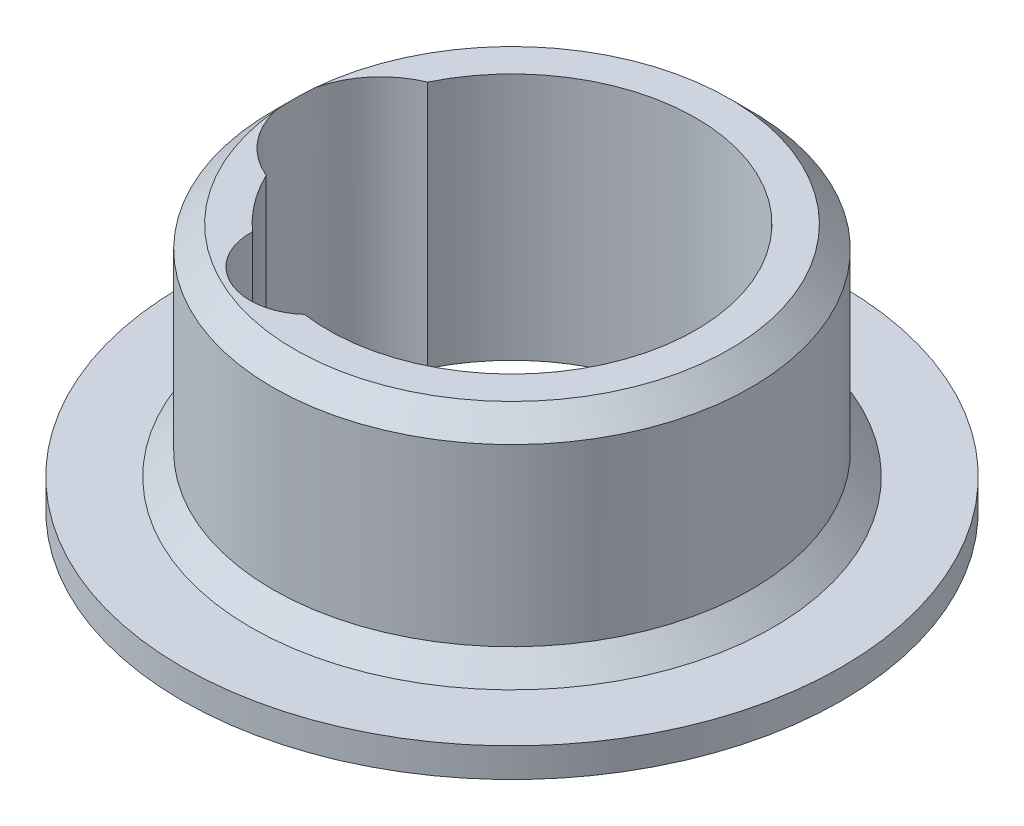
ISO-10303-21;
HEADER;
FILE_DESCRIPTION(('STEP AP214'),'2;1');
FILE_NAME('part.step','',(''),(''),'','','');
FILE_SCHEMA(('AUTOMOTIVE_DESIGN { 1 0 10303 214 1 1 1 1 }'));
ENDSEC;
DATA;
#1=APPLICATION_CONTEXT('core data for automotive mechanical design processes');
#2=APPLICATION_PROTOCOL_DEFINITION('international standard','automotive_design',2000,#1);
#3=PRODUCT_CONTEXT('',#1,'mechanical');
#4=PRODUCT('Part','Part','',(#3));
#5=PRODUCT_RELATED_PRODUCT_CATEGORY('part','',(#4));
#6=PRODUCT_DEFINITION_FORMATION('','',#4);
#7=PRODUCT_DEFINITION_CONTEXT('part definition',#1,'design');
#8=PRODUCT_DEFINITION('design','',#6,#7);
#9=PRODUCT_DEFINITION_SHAPE('','',#8);
#10=(LENGTH_UNIT() NAMED_UNIT(*) SI_UNIT(.MILLI.,.METRE.));
#11=(NAMED_UNIT(*) PLANE_ANGLE_UNIT() SI_UNIT($,.RADIAN.));
#12=(NAMED_UNIT(*) SI_UNIT($,.STERADIAN.) SOLID_ANGLE_UNIT());
#13=UNCERTAINTY_MEASURE_WITH_UNIT(LENGTH_MEASURE(1.E-05),#10,'distance_accuracy_value','');
#14=(GEOMETRIC_REPRESENTATION_CONTEXT(3) GLOBAL_UNCERTAINTY_ASSIGNED_CONTEXT((#13)) GLOBAL_UNIT_ASSIGNED_CONTEXT((#10,
#11,#12)) REPRESENTATION_CONTEXT('',''));
#15=CARTESIAN_POINT('',(0.,0.,0.));
#16=DIRECTION('',(0.,0.,1.));
#17=DIRECTION('',(1.,0.,0.));
#18=AXIS2_PLACEMENT_3D('',#15,#16,#17);
#19=CARTESIAN_POINT('',(0.,2.,0.));
#20=DIRECTION('',(0.,-1.,0.));
#21=DIRECTION('',(0.,0.,-1.));
#22=AXIS2_PLACEMENT_3D('',#19,#20,#21);
#23=CYLINDRICAL_SURFACE('',#22,12.6);
#24=CARTESIAN_POINT('',(0.,17.,0.));
#25=DIRECTION('',(0.,1.,0.));
#26=DIRECTION('',(0.,0.,1.));
#27=AXIS2_PLACEMENT_3D('',#24,#25,#26);
#28=CIRCLE('',#27,12.6);
#29=CARTESIAN_POINT('',(-11.32,17.,5.53331726905299));
#30=VERTEX_POINT('',#29);
#31=CARTESIAN_POINT('',(-8.43446094107925,17.,9.36054852203697));
#32=VERTEX_POINT('',#31);
#33=EDGE_CURVE('E102',#30,#32,#28,.T.);
#34=ORIENTED_EDGE('',*,*,#33,.T.);
#35=DIRECTION('',(0.,-1.,0.));
#36=VECTOR('',#35,1.);
#37=CARTESIAN_POINT('',(-8.43446094107925,8.5,9.36054852203697));
#38=LINE('',#37,#36);
#39=CARTESIAN_POINT('',(-8.43446094107925,0.,9.36054852203697));
#40=VERTEX_POINT('',#39);
#41=EDGE_CURVE('E50',#32,#40,#38,.T.);
#42=ORIENTED_EDGE('',*,*,#41,.T.);
#43=CARTESIAN_POINT('',(0.,0.,0.));
#44=DIRECTION('',(0.,1.,0.));
#45=DIRECTION('',(0.,0.,1.));
#46=AXIS2_PLACEMENT_3D('',#43,#44,#45);
#47=CIRCLE('',#46,12.6);
#48=CARTESIAN_POINT('',(-11.32,0.,5.53331726905299));
#49=VERTEX_POINT('',#48);
#50=EDGE_CURVE('E110',#49,#40,#47,.T.);
#51=ORIENTED_EDGE('',*,*,#50,.F.);
#52=DIRECTION('',(0.,-1.,0.));
#53=VECTOR('',#52,1.);
#54=CARTESIAN_POINT('',(-11.32,8.5,5.53331726905299));
#55=LINE('',#54,#53);
#56=EDGE_CURVE('E88',#49,#30,#55,.F.);
#57=ORIENTED_EDGE('',*,*,#56,.T.);
#58=EDGE_LOOP('',(#34,#42,#51,#57));
#59=FACE_BOUND('',#58,.T.);
#60=ADVANCED_FACE('F35',(#59),#23,.F.);
#61=CARTESIAN_POINT('',(-1.7490291925411,0.,12.4780165444528));
#62=VERTEX_POINT('',#61);
#63=CARTESIAN_POINT('',(-11.32,0.,-5.53331726905299));
#64=VERTEX_POINT('',#63);
#65=EDGE_CURVE('E105',#62,#64,#47,.T.);
#66=ORIENTED_EDGE('',*,*,#65,.F.);
#67=DIRECTION('',(0.,-1.,0.));
#68=VECTOR('',#67,1.);
#69=CARTESIAN_POINT('',(-1.7490291925411,8.5,12.4780165444528));
#70=LINE('',#69,#68);
#71=CARTESIAN_POINT('',(-1.74902919254111,17.,12.4780165444528));
#72=VERTEX_POINT('',#71);
#73=EDGE_CURVE('E87',#62,#72,#70,.F.);
#74=ORIENTED_EDGE('',*,*,#73,.T.);
#75=CARTESIAN_POINT('',(-11.32,17.,-5.53331726905299));
#76=VERTEX_POINT('',#75);
#77=EDGE_CURVE('E94',#72,#76,#28,.T.);
#78=ORIENTED_EDGE('',*,*,#77,.T.);
#79=DIRECTION('',(0.,-1.,0.));
#80=VECTOR('',#79,1.);
#81=CARTESIAN_POINT('',(-11.32,8.5,-5.53331726905299));
#82=LINE('',#81,#80);
#83=EDGE_CURVE('E79',#76,#64,#82,.T.);
#84=ORIENTED_EDGE('',*,*,#83,.T.);
#85=EDGE_LOOP('',(#66,#74,#78,#84));
#86=FACE_BOUND('',#85,.T.);
#87=ADVANCED_FACE('F101',(#86),#23,.F.);
#88=CARTESIAN_POINT('',(0.,17.,0.));
#89=DIRECTION('',(0.,-1.,0.));
#90=DIRECTION('',(0.,0.,-1.));
#91=AXIS2_PLACEMENT_3D('',#88,#89,#90);
#92=CONICAL_SURFACE('',#91,14.9,0.785398163397447);
#93=CARTESIAN_POINT('',(0.,15.5,0.));
#94=DIRECTION('',(0.,1.,0.));
#95=DIRECTION('',(0.,0.,1.));
#96=AXIS2_PLACEMENT_3D('',#93,#94,#95);
#97=CIRCLE('',#96,16.4);
#98=CARTESIAN_POINT('',(0.,15.5,16.4));
#99=VERTEX_POINT('',#98);
#100=EDGE_CURVE('E121',#99,#99,#97,.F.);
#101=ORIENTED_EDGE('',*,*,#100,.F.);
#102=EDGE_LOOP('',(#101));
#103=FACE_BOUND('',#102,.T.);
#104=CARTESIAN_POINT('',(0.,17.,0.));
#105=DIRECTION('',(0.,1.,0.));
#106=DIRECTION('',(0.,0.,1.));
#107=AXIS2_PLACEMENT_3D('',#104,#105,#106);
#108=CIRCLE('',#107,14.9);
#109=CARTESIAN_POINT('',(-14.8338888888889,17.,1.40204865539641));
#110=VERTEX_POINT('',#109);
#111=CARTESIAN_POINT('',(-14.8338888888889,17.,-1.40204865539641));
#112=VERTEX_POINT('',#111);
#113=EDGE_CURVE('E97',#110,#112,#108,.T.);
#114=ORIENTED_EDGE('',*,*,#113,.F.);
#115=CARTESIAN_POINT('',(-13.1740823327844,18.0387777598756,4.3101086621032));
#116=CARTESIAN_POINT('',(-13.2812787352416,17.9691750214918,4.20631419640567));
#117=CARTESIAN_POINT('',(-13.3854469041669,17.9020645110911,4.09766550659816));
#118=CARTESIAN_POINT('',(-13.5868019883373,17.7731961994844,3.87094477164192));
#119=CARTESIAN_POINT('',(-13.6839833188587,17.7114426722567,3.75286534399564));
#120=CARTESIAN_POINT('',(-13.8703563481507,17.5937116882185,3.50761628938948));
#121=CARTESIAN_POINT('',(-13.9595403153277,17.53773981315,3.38043807503303));
#122=CARTESIAN_POINT('',(-14.1287475318279,17.4320960788176,3.11775000347546));
#123=CARTESIAN_POINT('',(-14.2087743764662,17.3824217461486,2.98224344853279));
#124=CARTESIAN_POINT('',(-14.4036987746067,17.2619644825541,2.61993000763345));
#125=CARTESIAN_POINT('',(-14.510756852405,17.1963690856103,2.38706962222009));
#126=CARTESIAN_POINT('',(-14.6951492671273,17.0839320634582,1.90567637117447));
#127=CARTESIAN_POINT('',(-14.772505344858,17.0370767201474,1.65715512444694));
#128=CARTESIAN_POINT('',(-14.8673558061589,16.9797854113059,1.26296355457812));
#129=CARTESIAN_POINT('',(-14.8961573846878,16.9624288918613,1.12090531717421));
#130=CARTESIAN_POINT('',(-14.9434568649052,16.9339573970457,0.834480690181248));
#131=CARTESIAN_POINT('',(-14.9619578298858,16.9228405660502,0.690114999956206));
#132=CARTESIAN_POINT('',(-14.9884141481795,16.9069510395924,0.400118729801096));
#133=CARTESIAN_POINT('',(-14.9963725398987,16.9021765162541,0.254488526492392));
#134=CARTESIAN_POINT('',(-15.0016561797809,16.8990062752455,-0.0369871678342193));
#135=CARTESIAN_POINT('',(-14.99898431379,16.9006088263609,-0.182832589679684));
#136=CARTESIAN_POINT('',(-14.9810503743423,16.9113726883445,-0.510046099215776));
#137=CARTESIAN_POINT('',(-14.9628145371252,16.922319448847,-0.69120204406204));
#138=CARTESIAN_POINT('',(-14.9101541055416,16.9539964341598,-1.05023862662286));
#139=CARTESIAN_POINT('',(-14.8757314889123,16.9747254637515,-1.22811966171488));
#140=CARTESIAN_POINT('',(-14.7963886046394,17.0226516062133,-1.55792904163438));
#141=CARTESIAN_POINT('',(-14.7531987545188,17.0487892931889,-1.71043225531484));
#142=CARTESIAN_POINT('',(-14.6553815150557,17.108186405903,-2.01036016490023));
#143=CARTESIAN_POINT('',(-14.600749805371,17.1414485218691,-2.15778291791271));
#144=CARTESIAN_POINT('',(-14.4807395966339,17.2148149884928,-2.44662721553154));
#145=CARTESIAN_POINT('',(-14.4153482324007,17.2549275323226,-2.58804131783802));
#146=CARTESIAN_POINT('',(-14.2746838824578,17.341628216465,-2.86385866184187));
#147=CARTESIAN_POINT('',(-14.1994068676149,17.3882189975959,-2.99825901353714));
#148=CARTESIAN_POINT('',(-14.0403518848477,17.4872012270934,-3.2585246180598));
#149=CARTESIAN_POINT('',(-13.956624304906,17.5395584451353,-3.38443376970832));
#150=CARTESIAN_POINT('',(-13.7812056774405,17.649921123316,-3.6280313632243));
#151=CARTESIAN_POINT('',(-13.6895113090699,17.7079289400621,-3.74571633971941));
#152=CARTESIAN_POINT('',(-13.4991546055221,17.8291629838064,-3.97234162311977));
#153=CARTESIAN_POINT('',(-13.4004949399716,17.8923872130326,-4.08128524653137));
#154=CARTESIAN_POINT('',(-13.1970793399987,18.0236985337787,-4.29019708955738));
#155=CARTESIAN_POINT('',(-13.0923223777801,18.0917864455918,-4.39016378870464));
#156=CARTESIAN_POINT('',(-12.8475806241516,18.2521233686753,-4.60758832538934));
#157=CARTESIAN_POINT('',(-12.7059342695731,18.3458057816603,-4.72212390838052));
#158=CARTESIAN_POINT('',(-12.4163207719672,18.5394922635653,-4.93569587672355));
#159=CARTESIAN_POINT('',(-12.268374632765,18.6394757888898,-5.03477930781841));
#160=CARTESIAN_POINT('',(-12.1179389846637,18.7423823689869,-5.12625169962561));
#161=B_SPLINE_CURVE_WITH_KNOTS('',3,(#115,#116,#117,#118,#119,#120,#121,#122,#123,#124,#125,
#126,#127,#128,#129,#130,#131,#132,#133,#134,#135,#136,#137,#138,#139,#140,#141,#142,#143,#144,
#145,#146,#147,#148,#149,#150,#151,#152,#153,#154,#155,#156,#157,#158,#159,#160),.UNSPECIFIED.,
.F.,.F.,(4,2,2,2,2,2,2,2,2,2,2,2,2,2,2,2,2,2,2,2,2,2,4),(0.,0.493876743873443,0.988143962903769,
1.48288398482287,1.97742908806053,2.76831465112923,3.55862020550179,3.99612556852465,
4.43350075254617,4.87074985608493,5.30788026565542,5.85402933141939,6.40011168479384,
6.88139330022225,7.36285697191179,7.84490056359562,8.32714123698815,8.80665959354267,
9.28637879861546,9.76591512699559,10.2455325242788,10.8592230234949,11.4710069772593),.UNSPECIFIED.);
#162=EDGE_CURVE('E43',#110,#112,#161,.T.);
#163=ORIENTED_EDGE('',*,*,#162,.T.);
#164=EDGE_LOOP('',(#114,#163));
#165=FACE_BOUND('',#164,.T.);
#166=ADVANCED_FACE('F130',(#103,#165),#92,.T.);
#167=CARTESIAN_POINT('',(0.,2.,0.));
#168=DIRECTION('',(0.,1.,0.));
#169=DIRECTION('',(0.,0.,1.));
#170=AXIS2_PLACEMENT_3D('',#167,#168,#169);
#171=PLANE('',#170);
#172=CARTESIAN_POINT('',(0.,2.,0.));
#173=DIRECTION('',(0.,1.,0.));
#174=DIRECTION('',(0.,0.,1.));
#175=AXIS2_PLACEMENT_3D('',#172,#173,#174);
#176=CIRCLE('',#175,17.9);
#177=CARTESIAN_POINT('',(0.,2.,17.9));
#178=VERTEX_POINT('',#177);
#179=EDGE_CURVE('E124',#178,#178,#176,.F.);
#180=ORIENTED_EDGE('',*,*,#179,.T.);
#181=EDGE_LOOP('',(#180));
#182=FACE_BOUND('',#181,.T.);
#183=CARTESIAN_POINT('',(0.,2.,0.));
#184=DIRECTION('',(0.,1.,0.));
#185=DIRECTION('',(0.,0.,1.));
#186=AXIS2_PLACEMENT_3D('',#183,#184,#185);
#187=CIRCLE('',#186,22.6);
#188=CARTESIAN_POINT('',(0.,2.,22.6));
#189=VERTEX_POINT('',#188);
#190=EDGE_CURVE('E111',#189,#189,#187,.T.);
#191=ORIENTED_EDGE('',*,*,#190,.T.);
#192=EDGE_LOOP('',(#191));
#193=FACE_BOUND('',#192,.T.);
#194=ADVANCED_FACE('F148',(#182,#193),#171,.T.);
#195=CARTESIAN_POINT('',(0.,0.,0.));
#196=DIRECTION('',(0.,1.,0.));
#197=DIRECTION('',(0.,0.,1.));
#198=AXIS2_PLACEMENT_3D('',#195,#196,#197);
#199=PLANE('',#198);
#200=CARTESIAN_POINT('',(-4.43749174827732,0.,9.51623176388484));
#201=DIRECTION('',(0.,1.,0.));
#202=DIRECTION('',(0.,0.,1.));
#203=AXIS2_PLACEMENT_3D('',#200,#201,#202);
#204=CIRCLE('',#203,4.);
#205=EDGE_CURVE('E241',#40,#62,#204,.T.);
#206=ORIENTED_EDGE('',*,*,#205,.T.);
#207=ORIENTED_EDGE('',*,*,#65,.T.);
#208=CARTESIAN_POINT('',(-9.,0.,0.));
#209=DIRECTION('',(0.,1.,0.));
#210=DIRECTION('',(0.,0.,1.));
#211=AXIS2_PLACEMENT_3D('',#208,#209,#210);
#212=CIRCLE('',#211,6.);
#213=EDGE_CURVE('E82',#64,#49,#212,.T.);
#214=ORIENTED_EDGE('',*,*,#213,.T.);
#215=ORIENTED_EDGE('',*,*,#50,.T.);
#216=EDGE_LOOP('',(#206,#207,#214,#215));
#217=FACE_BOUND('',#216,.T.);
#218=CARTESIAN_POINT('',(0.,0.,0.));
#219=DIRECTION('',(0.,1.,0.));
#220=DIRECTION('',(0.,0.,1.));
#221=AXIS2_PLACEMENT_3D('',#218,#219,#220);
#222=CIRCLE('',#221,22.6);
#223=CARTESIAN_POINT('',(0.,0.,22.6));
#224=VERTEX_POINT('',#223);
#225=EDGE_CURVE('E114',#224,#224,#222,.T.);
#226=ORIENTED_EDGE('',*,*,#225,.F.);
#227=EDGE_LOOP('',(#226));
#228=FACE_BOUND('',#227,.T.);
#229=ADVANCED_FACE('F151',(#217,#228),#199,.F.);
#230=CARTESIAN_POINT('',(0.,2.,0.));
#231=DIRECTION('',(0.,-1.,0.));
#232=DIRECTION('',(0.,0.,-1.));
#233=AXIS2_PLACEMENT_3D('',#230,#231,#232);
#234=CYLINDRICAL_SURFACE('',#233,22.6);
#235=ORIENTED_EDGE('',*,*,#190,.F.);
#236=EDGE_LOOP('',(#235));
#237=FACE_BOUND('',#236,.T.);
#238=ORIENTED_EDGE('',*,*,#225,.T.);
#239=EDGE_LOOP('',(#238));
#240=FACE_BOUND('',#239,.T.);
#241=ADVANCED_FACE('F141',(#237,#240),#234,.T.);
#242=CARTESIAN_POINT('',(0.,17.,0.));
#243=DIRECTION('',(0.,1.,0.));
#244=DIRECTION('',(0.,0.,1.));
#245=AXIS2_PLACEMENT_3D('',#242,#243,#244);
#246=PLANE('',#245);
#247=ORIENTED_EDGE('',*,*,#77,.F.);
#248=CARTESIAN_POINT('',(-4.43749174827732,17.,9.51623176388484));
#249=DIRECTION('',(0.,1.,0.));
#250=DIRECTION('',(0.,0.,1.));
#251=AXIS2_PLACEMENT_3D('',#248,#249,#250);
#252=CIRCLE('',#251,4.);
#253=EDGE_CURVE('E11',#72,#32,#252,.F.);
#254=ORIENTED_EDGE('',*,*,#253,.T.);
#255=ORIENTED_EDGE('',*,*,#33,.F.);
#256=CARTESIAN_POINT('',(-9.,17.,0.));
#257=DIRECTION('',(0.,1.,0.));
#258=DIRECTION('',(0.,0.,1.));
#259=AXIS2_PLACEMENT_3D('',#256,#257,#258);
#260=CIRCLE('',#259,6.);
#261=EDGE_CURVE('E98',#110,#30,#260,.T.);
#262=ORIENTED_EDGE('',*,*,#261,.F.);
#263=ORIENTED_EDGE('',*,*,#113,.T.);
#264=EDGE_CURVE('E57',#76,#112,#260,.T.);
#265=ORIENTED_EDGE('',*,*,#264,.F.);
#266=EDGE_LOOP('',(#247,#254,#255,#262,#263,#265));
#267=FACE_BOUND('',#266,.T.);
#268=ADVANCED_FACE('F93',(#267),#246,.T.);
#269=CARTESIAN_POINT('',(0.,17.,0.));
#270=DIRECTION('',(0.,-1.,0.));
#271=DIRECTION('',(0.,0.,-1.));
#272=AXIS2_PLACEMENT_3D('',#269,#270,#271);
#273=CYLINDRICAL_SURFACE('',#272,16.4);
#274=ORIENTED_EDGE('',*,*,#100,.T.);
#275=EDGE_LOOP('',(#274));
#276=FACE_BOUND('',#275,.T.);
#277=CARTESIAN_POINT('',(0.,3.5,0.));
#278=DIRECTION('',(0.,1.,0.));
#279=DIRECTION('',(0.,0.,1.));
#280=AXIS2_PLACEMENT_3D('',#277,#278,#279);
#281=CIRCLE('',#280,16.4);
#282=CARTESIAN_POINT('',(0.,3.5,16.4));
#283=VERTEX_POINT('',#282);
#284=EDGE_CURVE('E118',#283,#283,#281,.T.);
#285=ORIENTED_EDGE('',*,*,#284,.T.);
#286=EDGE_LOOP('',(#285));
#287=FACE_BOUND('',#286,.T.);
#288=ADVANCED_FACE('F140',(#276,#287),#273,.T.);
#289=CARTESIAN_POINT('',(0.,3.5,0.));
#290=DIRECTION('',(0.,-1.,0.));
#291=DIRECTION('',(0.,0.,-1.));
#292=AXIS2_PLACEMENT_3D('',#289,#290,#291);
#293=CONICAL_SURFACE('',#292,16.4,0.785398163397445);
#294=ORIENTED_EDGE('',*,*,#179,.F.);
#295=EDGE_LOOP('',(#294));
#296=FACE_BOUND('',#295,.T.);
#297=ORIENTED_EDGE('',*,*,#284,.F.);
#298=EDGE_LOOP('',(#297));
#299=FACE_BOUND('',#298,.T.);
#300=ADVANCED_FACE('F37',(#296,#299),#293,.T.);
#301=CARTESIAN_POINT('',(-9.,17.,0.));
#302=DIRECTION('',(0.,-1.,0.));
#303=DIRECTION('',(0.,0.,-1.));
#304=AXIS2_PLACEMENT_3D('',#301,#302,#303);
#305=CYLINDRICAL_SURFACE('',#304,6.);
#306=ORIENTED_EDGE('',*,*,#264,.T.);
#307=ORIENTED_EDGE('',*,*,#162,.F.);
#308=ORIENTED_EDGE('',*,*,#261,.T.);
#309=ORIENTED_EDGE('',*,*,#56,.F.);
#310=ORIENTED_EDGE('',*,*,#213,.F.);
#311=ORIENTED_EDGE('',*,*,#83,.F.);
#312=EDGE_LOOP('',(#306,#307,#308,#309,#310,#311));
#313=FACE_BOUND('',#312,.T.);
#314=ADVANCED_FACE('F80',(#313),#305,.F.);
#315=CARTESIAN_POINT('',(-4.43749174827732,17.,9.51623176388484));
#316=DIRECTION('',(0.,-1.,0.));
#317=DIRECTION('',(0.,0.,-1.));
#318=AXIS2_PLACEMENT_3D('',#315,#316,#317);
#319=CYLINDRICAL_SURFACE('',#318,4.);
#320=ORIENTED_EDGE('',*,*,#253,.F.);
#321=ORIENTED_EDGE('',*,*,#73,.F.);
#322=ORIENTED_EDGE('',*,*,#205,.F.);
#323=ORIENTED_EDGE('',*,*,#41,.F.);
#324=EDGE_LOOP('',(#320,#321,#322,#323));
#325=FACE_BOUND('',#324,.T.);
#326=ADVANCED_FACE('F137',(#325),#319,.F.);
#327=CLOSED_SHELL('',(#60,#87,#166,#194,#229,#241,#268,#288,#300,#314,#326));
#328=MANIFOLD_SOLID_BREP('B2',#327);
#329=ADVANCED_BREP_SHAPE_REPRESENTATION('',(#18,#328),#14);
#330=SHAPE_DEFINITION_REPRESENTATION(#9,#329);
ENDSEC;
END-ISO-10303-21;
